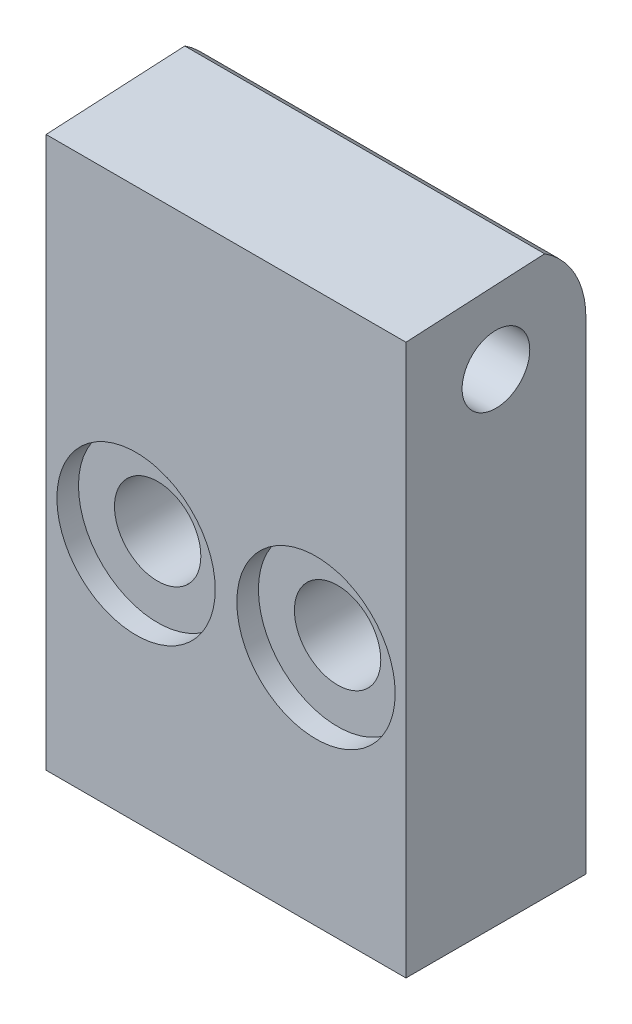
ISO-10303-21;
HEADER;
FILE_DESCRIPTION(('STEP AP214'),'2;1');
FILE_NAME('part.step','',(''),(''),'','','');
FILE_SCHEMA(('AUTOMOTIVE_DESIGN { 1 0 10303 214 1 1 1 1 }'));
ENDSEC;
DATA;
#1=APPLICATION_CONTEXT('core data for automotive mechanical design processes');
#2=APPLICATION_PROTOCOL_DEFINITION('international standard','automotive_design',2000,#1);
#3=PRODUCT_CONTEXT('',#1,'mechanical');
#4=PRODUCT('Part','Part','',(#3));
#5=PRODUCT_RELATED_PRODUCT_CATEGORY('part','',(#4));
#6=PRODUCT_DEFINITION_FORMATION('','',#4);
#7=PRODUCT_DEFINITION_CONTEXT('part definition',#1,'design');
#8=PRODUCT_DEFINITION('design','',#6,#7);
#9=PRODUCT_DEFINITION_SHAPE('','',#8);
#10=(LENGTH_UNIT() NAMED_UNIT(*) SI_UNIT(.MILLI.,.METRE.));
#11=(NAMED_UNIT(*) PLANE_ANGLE_UNIT() SI_UNIT($,.RADIAN.));
#12=(NAMED_UNIT(*) SI_UNIT($,.STERADIAN.) SOLID_ANGLE_UNIT());
#13=UNCERTAINTY_MEASURE_WITH_UNIT(LENGTH_MEASURE(1.E-05),#10,'distance_accuracy_value','');
#14=(GEOMETRIC_REPRESENTATION_CONTEXT(3) GLOBAL_UNCERTAINTY_ASSIGNED_CONTEXT((#13)) GLOBAL_UNIT_ASSIGNED_CONTEXT((#10,
#11,#12)) REPRESENTATION_CONTEXT('',''));
#15=CARTESIAN_POINT('',(0.,0.,0.));
#16=DIRECTION('',(0.,0.,1.));
#17=DIRECTION('',(1.,0.,0.));
#18=AXIS2_PLACEMENT_3D('',#15,#16,#17);
#19=CARTESIAN_POINT('',(9.525,8.509,0.));
#20=DIRECTION('',(0.,0.,1.));
#21=DIRECTION('',(1.,0.,0.));
#22=AXIS2_PLACEMENT_3D('',#19,#20,#21);
#23=CYLINDRICAL_SURFACE('',#22,1.524);
#24=CARTESIAN_POINT('',(9.525,8.509,0.));
#25=DIRECTION('',(0.,0.,1.));
#26=DIRECTION('',(1.,0.,0.));
#27=AXIS2_PLACEMENT_3D('',#24,#25,#26);
#28=CIRCLE('',#27,1.524);
#29=CARTESIAN_POINT('',(11.049,8.509,0.));
#30=VERTEX_POINT('',#29);
#31=EDGE_CURVE('E116',#30,#30,#28,.T.);
#32=ORIENTED_EDGE('',*,*,#31,.F.);
#33=EDGE_LOOP('',(#32));
#34=FACE_BOUND('',#33,.T.);
#35=CARTESIAN_POINT('',(9.525,8.509,5.588));
#36=DIRECTION('',(0.,0.,1.));
#37=DIRECTION('',(1.,0.,0.));
#38=AXIS2_PLACEMENT_3D('',#35,#36,#37);
#39=CIRCLE('',#38,1.524);
#40=CARTESIAN_POINT('',(11.049,8.509,5.588));
#41=VERTEX_POINT('',#40);
#42=EDGE_CURVE('E118',#41,#41,#39,.F.);
#43=ORIENTED_EDGE('',*,*,#42,.F.);
#44=EDGE_LOOP('',(#43));
#45=FACE_BOUND('',#44,.T.);
#46=ADVANCED_FACE('F33',(#34,#45),#23,.F.);
#47=CARTESIAN_POINT('',(3.175,8.509,0.));
#48=DIRECTION('',(0.,0.,1.));
#49=DIRECTION('',(1.,0.,0.));
#50=AXIS2_PLACEMENT_3D('',#47,#48,#49);
#51=CYLINDRICAL_SURFACE('',#50,1.524);
#52=CARTESIAN_POINT('',(3.175,8.509,0.));
#53=DIRECTION('',(0.,0.,1.));
#54=DIRECTION('',(1.,0.,0.));
#55=AXIS2_PLACEMENT_3D('',#52,#53,#54);
#56=CIRCLE('',#55,1.524);
#57=CARTESIAN_POINT('',(4.699,8.509,0.));
#58=VERTEX_POINT('',#57);
#59=EDGE_CURVE('E103',#58,#58,#56,.T.);
#60=ORIENTED_EDGE('',*,*,#59,.F.);
#61=EDGE_LOOP('',(#60));
#62=FACE_BOUND('',#61,.T.);
#63=CARTESIAN_POINT('',(3.175,8.509,5.588));
#64=DIRECTION('',(0.,0.,1.));
#65=DIRECTION('',(1.,0.,0.));
#66=AXIS2_PLACEMENT_3D('',#63,#64,#65);
#67=CIRCLE('',#66,1.524);
#68=CARTESIAN_POINT('',(4.699,8.509,5.588));
#69=VERTEX_POINT('',#68);
#70=EDGE_CURVE('E114',#69,#69,#67,.F.);
#71=ORIENTED_EDGE('',*,*,#70,.F.);
#72=EDGE_LOOP('',(#71));
#73=FACE_BOUND('',#72,.T.);
#74=ADVANCED_FACE('F147',(#62,#73),#51,.F.);
#75=CARTESIAN_POINT('',(0.,0.,6.35));
#76=DIRECTION('',(1.,0.,0.));
#77=DIRECTION('',(0.,0.,-1.));
#78=AXIS2_PLACEMENT_3D('',#75,#76,#77);
#79=PLANE('',#78);
#80=CARTESIAN_POINT('',(0.,17.018,3.175));
#81=DIRECTION('',(1.,0.,0.));
#82=DIRECTION('',(0.,0.,-1.));
#83=AXIS2_PLACEMENT_3D('',#80,#81,#82);
#84=CIRCLE('',#83,1.1938);
#85=CARTESIAN_POINT('',(0.,17.018,1.9812));
#86=VERTEX_POINT('',#85);
#87=EDGE_CURVE('E132',#86,#86,#84,.T.);
#88=ORIENTED_EDGE('',*,*,#87,.T.);
#89=EDGE_LOOP('',(#88));
#90=FACE_BOUND('',#89,.T.);
#91=DIRECTION('',(0.,-1.,0.));
#92=VECTOR('',#91,1.);
#93=CARTESIAN_POINT('',(0.,0.,6.35));
#94=LINE('',#93,#92);
#95=CARTESIAN_POINT('',(0.,19.431,6.35));
#96=VERTEX_POINT('',#95);
#97=CARTESIAN_POINT('',(0.,0.,6.35));
#98=VERTEX_POINT('',#97);
#99=EDGE_CURVE('E89',#96,#98,#94,.T.);
#100=ORIENTED_EDGE('',*,*,#99,.F.);
#101=DIRECTION('',(0.,0.0523359562429444,-0.998629534754574));
#102=VECTOR('',#101,1.);
#103=CARTESIAN_POINT('',(0.,19.431,6.35));
#104=LINE('',#103,#102);
#105=CARTESIAN_POINT('',(0.,19.6874769183394,1.45612886391876));
#106=VERTEX_POINT('',#105);
#107=EDGE_CURVE('E78',#96,#106,#104,.T.);
#108=ORIENTED_EDGE('',*,*,#107,.T.);
#109=CARTESIAN_POINT('',(0.,17.018,3.175));
#110=DIRECTION('',(-1.,0.,0.));
#111=DIRECTION('',(0.,0.,1.));
#112=AXIS2_PLACEMENT_3D('',#109,#110,#111);
#113=CIRCLE('',#112,3.175);
#114=CARTESIAN_POINT('',(0.,17.018,0.));
#115=VERTEX_POINT('',#114);
#116=EDGE_CURVE('E195',#106,#115,#113,.T.);
#117=ORIENTED_EDGE('',*,*,#116,.T.);
#118=DIRECTION('',(0.,-1.,0.));
#119=VECTOR('',#118,1.);
#120=CARTESIAN_POINT('',(0.,0.,0.));
#121=LINE('',#120,#119);
#122=CARTESIAN_POINT('',(0.,0.,0.));
#123=VERTEX_POINT('',#122);
#124=EDGE_CURVE('E108',#115,#123,#121,.T.);
#125=ORIENTED_EDGE('',*,*,#124,.T.);
#126=DIRECTION('',(0.,0.,-1.));
#127=VECTOR('',#126,1.);
#128=CARTESIAN_POINT('',(0.,0.,6.35));
#129=LINE('',#128,#127);
#130=EDGE_CURVE('E41',#98,#123,#129,.T.);
#131=ORIENTED_EDGE('',*,*,#130,.F.);
#132=EDGE_LOOP('',(#100,#108,#117,#125,#131));
#133=FACE_BOUND('',#132,.T.);
#134=ADVANCED_FACE('F35',(#90,#133),#79,.F.);
#135=CARTESIAN_POINT('',(0.,0.,6.35));
#136=DIRECTION('',(0.,1.,0.));
#137=DIRECTION('',(0.,0.,1.));
#138=AXIS2_PLACEMENT_3D('',#135,#136,#137);
#139=PLANE('',#138);
#140=DIRECTION('',(1.,0.,0.));
#141=VECTOR('',#140,1.);
#142=CARTESIAN_POINT('',(0.,0.,0.));
#143=LINE('',#142,#141);
#144=CARTESIAN_POINT('',(12.7,0.,0.));
#145=VERTEX_POINT('',#144);
#146=EDGE_CURVE('E100',#123,#145,#143,.T.);
#147=ORIENTED_EDGE('',*,*,#146,.T.);
#148=DIRECTION('',(0.,0.,-1.));
#149=VECTOR('',#148,1.);
#150=CARTESIAN_POINT('',(12.7,0.,6.35));
#151=LINE('',#150,#149);
#152=CARTESIAN_POINT('',(12.7,0.,6.35));
#153=VERTEX_POINT('',#152);
#154=EDGE_CURVE('E107',#153,#145,#151,.T.);
#155=ORIENTED_EDGE('',*,*,#154,.F.);
#156=DIRECTION('',(1.,0.,0.));
#157=VECTOR('',#156,1.);
#158=CARTESIAN_POINT('',(0.,0.,6.35));
#159=LINE('',#158,#157);
#160=EDGE_CURVE('E96',#98,#153,#159,.T.);
#161=ORIENTED_EDGE('',*,*,#160,.F.);
#162=ORIENTED_EDGE('',*,*,#130,.T.);
#163=EDGE_LOOP('',(#147,#155,#161,#162));
#164=FACE_BOUND('',#163,.T.);
#165=ADVANCED_FACE('F180',(#164),#139,.F.);
#166=CARTESIAN_POINT('',(12.7,0.,6.35));
#167=DIRECTION('',(-1.,0.,0.));
#168=DIRECTION('',(0.,0.,1.));
#169=AXIS2_PLACEMENT_3D('',#166,#167,#168);
#170=PLANE('',#169);
#171=CARTESIAN_POINT('',(12.7,17.018,3.175));
#172=DIRECTION('',(1.,0.,0.));
#173=DIRECTION('',(0.,0.,-1.));
#174=AXIS2_PLACEMENT_3D('',#171,#172,#173);
#175=CIRCLE('',#174,1.1938);
#176=CARTESIAN_POINT('',(12.7,17.018,1.9812));
#177=VERTEX_POINT('',#176);
#178=EDGE_CURVE('E135',#177,#177,#175,.T.);
#179=ORIENTED_EDGE('',*,*,#178,.F.);
#180=EDGE_LOOP('',(#179));
#181=FACE_BOUND('',#180,.T.);
#182=CARTESIAN_POINT('',(12.7,17.018,3.175));
#183=DIRECTION('',(-1.,0.,0.));
#184=DIRECTION('',(0.,0.,1.));
#185=AXIS2_PLACEMENT_3D('',#182,#183,#184);
#186=CIRCLE('',#185,3.175);
#187=CARTESIAN_POINT('',(12.7,19.6874769183394,1.45612886391876));
#188=VERTEX_POINT('',#187);
#189=CARTESIAN_POINT('',(12.7,17.018,0.));
#190=VERTEX_POINT('',#189);
#191=EDGE_CURVE('E54',#188,#190,#186,.T.);
#192=ORIENTED_EDGE('',*,*,#191,.F.);
#193=DIRECTION('',(0.,0.0523359562429444,-0.998629534754574));
#194=VECTOR('',#193,1.);
#195=CARTESIAN_POINT('',(12.7,19.431,6.35));
#196=LINE('',#195,#194);
#197=CARTESIAN_POINT('',(12.7,19.431,6.35));
#198=VERTEX_POINT('',#197);
#199=EDGE_CURVE('E48',#198,#188,#196,.T.);
#200=ORIENTED_EDGE('',*,*,#199,.F.);
#201=DIRECTION('',(0.,1.,0.));
#202=VECTOR('',#201,1.);
#203=CARTESIAN_POINT('',(12.7,0.,6.35));
#204=LINE('',#203,#202);
#205=EDGE_CURVE('E92',#153,#198,#204,.T.);
#206=ORIENTED_EDGE('',*,*,#205,.F.);
#207=ORIENTED_EDGE('',*,*,#154,.T.);
#208=DIRECTION('',(0.,1.,0.));
#209=VECTOR('',#208,1.);
#210=CARTESIAN_POINT('',(12.7,0.,0.));
#211=LINE('',#210,#209);
#212=EDGE_CURVE('E97',#145,#190,#211,.T.);
#213=ORIENTED_EDGE('',*,*,#212,.T.);
#214=EDGE_LOOP('',(#192,#200,#206,#207,#213));
#215=FACE_BOUND('',#214,.T.);
#216=ADVANCED_FACE('F176',(#181,#215),#170,.F.);
#217=CARTESIAN_POINT('',(0.,0.,6.35));
#218=DIRECTION('',(0.,0.,-1.));
#219=DIRECTION('',(-1.,0.,0.));
#220=AXIS2_PLACEMENT_3D('',#217,#218,#219);
#221=PLANE('',#220);
#222=CARTESIAN_POINT('',(9.525,8.509,6.35));
#223=DIRECTION('',(0.,0.,1.));
#224=DIRECTION('',(1.,0.,0.));
#225=AXIS2_PLACEMENT_3D('',#222,#223,#224);
#226=CIRCLE('',#225,2.794);
#227=CARTESIAN_POINT('',(12.319,8.509,6.35));
#228=VERTEX_POINT('',#227);
#229=EDGE_CURVE('E127',#228,#228,#226,.T.);
#230=ORIENTED_EDGE('',*,*,#229,.F.);
#231=EDGE_LOOP('',(#230));
#232=FACE_BOUND('',#231,.T.);
#233=CARTESIAN_POINT('',(3.175,8.509,6.35));
#234=DIRECTION('',(0.,0.,1.));
#235=DIRECTION('',(1.,0.,0.));
#236=AXIS2_PLACEMENT_3D('',#233,#234,#235);
#237=CIRCLE('',#236,2.794);
#238=CARTESIAN_POINT('',(5.969,8.509,6.35));
#239=VERTEX_POINT('',#238);
#240=EDGE_CURVE('E120',#239,#239,#237,.T.);
#241=ORIENTED_EDGE('',*,*,#240,.F.);
#242=EDGE_LOOP('',(#241));
#243=FACE_BOUND('',#242,.T.);
#244=ORIENTED_EDGE('',*,*,#205,.T.);
#245=DIRECTION('',(1.,0.,0.));
#246=VECTOR('',#245,1.);
#247=CARTESIAN_POINT('',(0.,19.431,6.35));
#248=LINE('',#247,#246);
#249=EDGE_CURVE('E81',#96,#198,#248,.T.);
#250=ORIENTED_EDGE('',*,*,#249,.F.);
#251=ORIENTED_EDGE('',*,*,#99,.T.);
#252=ORIENTED_EDGE('',*,*,#160,.T.);
#253=EDGE_LOOP('',(#244,#250,#251,#252));
#254=FACE_BOUND('',#253,.T.);
#255=ADVANCED_FACE('F88',(#232,#243,#254),#221,.F.);
#256=CARTESIAN_POINT('',(0.,0.,0.));
#257=DIRECTION('',(0.,0.,-1.));
#258=DIRECTION('',(-1.,0.,0.));
#259=AXIS2_PLACEMENT_3D('',#256,#257,#258);
#260=PLANE('',#259);
#261=ORIENTED_EDGE('',*,*,#146,.F.);
#262=ORIENTED_EDGE('',*,*,#124,.F.);
#263=DIRECTION('',(1.,0.,0.));
#264=VECTOR('',#263,1.);
#265=CARTESIAN_POINT('',(0.,17.018,0.));
#266=LINE('',#265,#264);
#267=EDGE_CURVE('E194',#115,#190,#266,.T.);
#268=ORIENTED_EDGE('',*,*,#267,.T.);
#269=ORIENTED_EDGE('',*,*,#212,.F.);
#270=EDGE_LOOP('',(#261,#262,#268,#269));
#271=FACE_BOUND('',#270,.T.);
#272=ORIENTED_EDGE('',*,*,#31,.T.);
#273=EDGE_LOOP('',(#272));
#274=FACE_BOUND('',#273,.T.);
#275=ORIENTED_EDGE('',*,*,#59,.T.);
#276=EDGE_LOOP('',(#275));
#277=FACE_BOUND('',#276,.T.);
#278=ADVANCED_FACE('F145',(#271,#274,#277),#260,.T.);
#279=CARTESIAN_POINT('',(3.175,8.509,5.588));
#280=DIRECTION('',(0.,0.,1.));
#281=DIRECTION('',(1.,0.,0.));
#282=AXIS2_PLACEMENT_3D('',#279,#280,#281);
#283=PLANE('',#282);
#284=CARTESIAN_POINT('',(3.175,8.509,5.588));
#285=DIRECTION('',(0.,0.,1.));
#286=DIRECTION('',(1.,0.,0.));
#287=AXIS2_PLACEMENT_3D('',#284,#285,#286);
#288=CIRCLE('',#287,2.794);
#289=CARTESIAN_POINT('',(5.969,8.509,5.588));
#290=VERTEX_POINT('',#289);
#291=EDGE_CURVE('E117',#290,#290,#288,.T.);
#292=ORIENTED_EDGE('',*,*,#291,.T.);
#293=EDGE_LOOP('',(#292));
#294=FACE_BOUND('',#293,.T.);
#295=ORIENTED_EDGE('',*,*,#70,.T.);
#296=EDGE_LOOP('',(#295));
#297=FACE_BOUND('',#296,.T.);
#298=ADVANCED_FACE('F153',(#294,#297),#283,.T.);
#299=CARTESIAN_POINT('',(3.175,8.509,5.588));
#300=DIRECTION('',(0.,0.,1.));
#301=DIRECTION('',(1.,0.,0.));
#302=AXIS2_PLACEMENT_3D('',#299,#300,#301);
#303=CYLINDRICAL_SURFACE('',#302,2.794);
#304=CARTESIAN_POINT('',(5.969,8.509,5.588));
#305=CARTESIAN_POINT('',(5.969,8.509,5.5959375));
#306=CARTESIAN_POINT('',(5.969,8.509,5.603875));
#307=CARTESIAN_POINT('',(5.969,8.509,5.61975));
#308=CARTESIAN_POINT('',(5.969,8.509,5.6276875));
#309=CARTESIAN_POINT('',(5.969,8.509,5.6435625));
#310=CARTESIAN_POINT('',(5.969,8.509,5.6515));
#311=CARTESIAN_POINT('',(5.969,8.509,5.667375));
#312=CARTESIAN_POINT('',(5.969,8.509,5.6753125));
#313=CARTESIAN_POINT('',(5.969,8.509,5.6911875));
#314=CARTESIAN_POINT('',(5.969,8.509,5.699125));
#315=CARTESIAN_POINT('',(5.969,8.509,5.715));
#316=CARTESIAN_POINT('',(5.969,8.509,5.7229375));
#317=CARTESIAN_POINT('',(5.969,8.509,5.7388125));
#318=CARTESIAN_POINT('',(5.969,8.509,5.74675));
#319=CARTESIAN_POINT('',(5.969,8.509,5.762625));
#320=CARTESIAN_POINT('',(5.969,8.509,5.7705625));
#321=CARTESIAN_POINT('',(5.969,8.509,5.7864375));
#322=CARTESIAN_POINT('',(5.969,8.509,5.794375));
#323=CARTESIAN_POINT('',(5.969,8.509,5.81025));
#324=CARTESIAN_POINT('',(5.969,8.509,5.8181875));
#325=CARTESIAN_POINT('',(5.969,8.509,5.8340625));
#326=CARTESIAN_POINT('',(5.969,8.509,5.842));
#327=CARTESIAN_POINT('',(5.969,8.509,5.857875));
#328=CARTESIAN_POINT('',(5.969,8.509,5.8658125));
#329=CARTESIAN_POINT('',(5.969,8.509,5.8816875));
#330=CARTESIAN_POINT('',(5.969,8.509,5.889625));
#331=CARTESIAN_POINT('',(5.969,8.509,5.9055));
#332=CARTESIAN_POINT('',(5.969,8.509,5.9134375));
#333=CARTESIAN_POINT('',(5.969,8.509,5.9293125));
#334=CARTESIAN_POINT('',(5.969,8.509,5.93725));
#335=CARTESIAN_POINT('',(5.969,8.509,5.953125));
#336=CARTESIAN_POINT('',(5.969,8.509,5.9610625));
#337=CARTESIAN_POINT('',(5.969,8.509,5.9769375));
#338=CARTESIAN_POINT('',(5.969,8.509,5.984875));
#339=CARTESIAN_POINT('',(5.969,8.509,6.00075));
#340=CARTESIAN_POINT('',(5.969,8.509,6.0086875));
#341=CARTESIAN_POINT('',(5.969,8.509,6.0245625));
#342=CARTESIAN_POINT('',(5.969,8.509,6.0325));
#343=CARTESIAN_POINT('',(5.969,8.509,6.048375));
#344=CARTESIAN_POINT('',(5.969,8.509,6.0563125));
#345=CARTESIAN_POINT('',(5.969,8.509,6.0721875));
#346=CARTESIAN_POINT('',(5.969,8.509,6.080125));
#347=CARTESIAN_POINT('',(5.969,8.509,6.096));
#348=CARTESIAN_POINT('',(5.969,8.509,6.1039375));
#349=CARTESIAN_POINT('',(5.969,8.509,6.1198125));
#350=CARTESIAN_POINT('',(5.969,8.509,6.12775));
#351=CARTESIAN_POINT('',(5.969,8.509,6.143625));
#352=CARTESIAN_POINT('',(5.969,8.509,6.1515625));
#353=CARTESIAN_POINT('',(5.969,8.509,6.1674375));
#354=CARTESIAN_POINT('',(5.969,8.509,6.175375));
#355=CARTESIAN_POINT('',(5.969,8.509,6.19125));
#356=CARTESIAN_POINT('',(5.969,8.509,6.1991875));
#357=CARTESIAN_POINT('',(5.969,8.509,6.2150625));
#358=CARTESIAN_POINT('',(5.969,8.509,6.223));
#359=CARTESIAN_POINT('',(5.969,8.509,6.238875));
#360=CARTESIAN_POINT('',(5.969,8.509,6.2468125));
#361=CARTESIAN_POINT('',(5.969,8.509,6.2626875));
#362=CARTESIAN_POINT('',(5.969,8.509,6.270625));
#363=CARTESIAN_POINT('',(5.969,8.509,6.2865));
#364=CARTESIAN_POINT('',(5.969,8.509,6.2944375));
#365=CARTESIAN_POINT('',(5.969,8.509,6.3103125));
#366=CARTESIAN_POINT('',(5.969,8.509,6.31825));
#367=CARTESIAN_POINT('',(5.969,8.509,6.334125));
#368=CARTESIAN_POINT('',(5.969,8.509,6.3420625));
#369=CARTESIAN_POINT('',(5.969,8.509,6.35));
#370=B_SPLINE_CURVE_WITH_KNOTS('',3,(#304,#305,#306,#307,#308,#309,#310,#311,#312,#313,#314,
#315,#316,#317,#318,#319,#320,#321,#322,#323,#324,#325,#326,#327,#328,#329,#330,#331,#332,#333,
#334,#335,#336,#337,#338,#339,#340,#341,#342,#343,#344,#345,#346,#347,#348,#349,#350,#351,#352,
#353,#354,#355,#356,#357,#358,#359,#360,#361,#362,#363,#364,#365,#366,#367,#368,#369),
.UNSPECIFIED.,.F.,.F.,(4,2,2,2,2,2,2,2,2,2,2,2,2,2,2,2,2,2,2,2,2,2,2,2,2,2,2,2,2,2,2,2,4),(0.,
0.0238124999999995,0.0476249999999999,0.0714374999999995,0.0952499999999998,0.119062499999999,
0.142875,0.166687499999999,0.1905,0.214312499999999,0.238125,0.261937499999999,0.28575,
0.309562499999999,0.333374999999999,0.357187499999999,0.380999999999999,0.404812499999999,
0.428624999999999,0.4524375,0.476249999999999,0.5000625,0.523874999999999,0.5476875,
0.571499999999999,0.595312499999999,0.619124999999999,0.642937499999999,0.666749999999999,
0.690562499999999,0.714374999999999,0.738187499999999,0.761999999999999),.UNSPECIFIED.);
#371=EDGE_CURVE('BSEAM155',#290,#239,#370,.T.);
#372=ORIENTED_EDGE('',*,*,#291,.F.);
#373=ORIENTED_EDGE('',*,*,#240,.T.);
#374=ORIENTED_EDGE('',*,*,#371,.T.);
#375=ORIENTED_EDGE('',*,*,#371,.F.);
#376=EDGE_LOOP('',(#372,#374,#373,#375));
#377=FACE_BOUND('',#376,.T.);
#378=ADVANCED_FACE('F155',(#377),#303,.F.);
#379=CARTESIAN_POINT('',(9.525,8.509,5.588));
#380=DIRECTION('',(0.,0.,1.));
#381=DIRECTION('',(1.,0.,0.));
#382=AXIS2_PLACEMENT_3D('',#379,#380,#381);
#383=PLANE('',#382);
#384=CARTESIAN_POINT('',(9.525,8.509,5.588));
#385=DIRECTION('',(0.,0.,1.));
#386=DIRECTION('',(1.,0.,0.));
#387=AXIS2_PLACEMENT_3D('',#384,#385,#386);
#388=CIRCLE('',#387,2.794);
#389=CARTESIAN_POINT('',(12.319,8.509,5.588));
#390=VERTEX_POINT('',#389);
#391=EDGE_CURVE('E121',#390,#390,#388,.T.);
#392=ORIENTED_EDGE('',*,*,#391,.T.);
#393=EDGE_LOOP('',(#392));
#394=FACE_BOUND('',#393,.T.);
#395=ORIENTED_EDGE('',*,*,#42,.T.);
#396=EDGE_LOOP('',(#395));
#397=FACE_BOUND('',#396,.T.);
#398=ADVANCED_FACE('F162',(#394,#397),#383,.T.);
#399=CARTESIAN_POINT('',(9.525,8.509,5.588));
#400=DIRECTION('',(0.,0.,1.));
#401=DIRECTION('',(1.,0.,0.));
#402=AXIS2_PLACEMENT_3D('',#399,#400,#401);
#403=CYLINDRICAL_SURFACE('',#402,2.794);
#404=CARTESIAN_POINT('',(12.319,8.509,5.588));
#405=CARTESIAN_POINT('',(12.319,8.509,5.5959375));
#406=CARTESIAN_POINT('',(12.319,8.509,5.603875));
#407=CARTESIAN_POINT('',(12.319,8.509,5.61975));
#408=CARTESIAN_POINT('',(12.319,8.509,5.6276875));
#409=CARTESIAN_POINT('',(12.319,8.509,5.6435625));
#410=CARTESIAN_POINT('',(12.319,8.509,5.6515));
#411=CARTESIAN_POINT('',(12.319,8.509,5.667375));
#412=CARTESIAN_POINT('',(12.319,8.509,5.6753125));
#413=CARTESIAN_POINT('',(12.319,8.509,5.6911875));
#414=CARTESIAN_POINT('',(12.319,8.509,5.699125));
#415=CARTESIAN_POINT('',(12.319,8.509,5.715));
#416=CARTESIAN_POINT('',(12.319,8.509,5.7229375));
#417=CARTESIAN_POINT('',(12.319,8.509,5.7388125));
#418=CARTESIAN_POINT('',(12.319,8.509,5.74675));
#419=CARTESIAN_POINT('',(12.319,8.509,5.762625));
#420=CARTESIAN_POINT('',(12.319,8.509,5.7705625));
#421=CARTESIAN_POINT('',(12.319,8.509,5.7864375));
#422=CARTESIAN_POINT('',(12.319,8.509,5.794375));
#423=CARTESIAN_POINT('',(12.319,8.509,5.81025));
#424=CARTESIAN_POINT('',(12.319,8.509,5.8181875));
#425=CARTESIAN_POINT('',(12.319,8.509,5.8340625));
#426=CARTESIAN_POINT('',(12.319,8.509,5.842));
#427=CARTESIAN_POINT('',(12.319,8.509,5.857875));
#428=CARTESIAN_POINT('',(12.319,8.509,5.8658125));
#429=CARTESIAN_POINT('',(12.319,8.509,5.8816875));
#430=CARTESIAN_POINT('',(12.319,8.509,5.889625));
#431=CARTESIAN_POINT('',(12.319,8.509,5.9055));
#432=CARTESIAN_POINT('',(12.319,8.509,5.9134375));
#433=CARTESIAN_POINT('',(12.319,8.509,5.9293125));
#434=CARTESIAN_POINT('',(12.319,8.509,5.93725));
#435=CARTESIAN_POINT('',(12.319,8.509,5.953125));
#436=CARTESIAN_POINT('',(12.319,8.509,5.9610625));
#437=CARTESIAN_POINT('',(12.319,8.509,5.9769375));
#438=CARTESIAN_POINT('',(12.319,8.509,5.984875));
#439=CARTESIAN_POINT('',(12.319,8.509,6.00075));
#440=CARTESIAN_POINT('',(12.319,8.509,6.0086875));
#441=CARTESIAN_POINT('',(12.319,8.509,6.0245625));
#442=CARTESIAN_POINT('',(12.319,8.509,6.0325));
#443=CARTESIAN_POINT('',(12.319,8.509,6.048375));
#444=CARTESIAN_POINT('',(12.319,8.509,6.0563125));
#445=CARTESIAN_POINT('',(12.319,8.509,6.0721875));
#446=CARTESIAN_POINT('',(12.319,8.509,6.080125));
#447=CARTESIAN_POINT('',(12.319,8.509,6.096));
#448=CARTESIAN_POINT('',(12.319,8.509,6.1039375));
#449=CARTESIAN_POINT('',(12.319,8.509,6.1198125));
#450=CARTESIAN_POINT('',(12.319,8.509,6.12775));
#451=CARTESIAN_POINT('',(12.319,8.509,6.143625));
#452=CARTESIAN_POINT('',(12.319,8.509,6.1515625));
#453=CARTESIAN_POINT('',(12.319,8.509,6.1674375));
#454=CARTESIAN_POINT('',(12.319,8.509,6.175375));
#455=CARTESIAN_POINT('',(12.319,8.509,6.19125));
#456=CARTESIAN_POINT('',(12.319,8.509,6.1991875));
#457=CARTESIAN_POINT('',(12.319,8.509,6.2150625));
#458=CARTESIAN_POINT('',(12.319,8.509,6.223));
#459=CARTESIAN_POINT('',(12.319,8.509,6.238875));
#460=CARTESIAN_POINT('',(12.319,8.509,6.2468125));
#461=CARTESIAN_POINT('',(12.319,8.509,6.2626875));
#462=CARTESIAN_POINT('',(12.319,8.509,6.270625));
#463=CARTESIAN_POINT('',(12.319,8.509,6.2865));
#464=CARTESIAN_POINT('',(12.319,8.509,6.2944375));
#465=CARTESIAN_POINT('',(12.319,8.509,6.3103125));
#466=CARTESIAN_POINT('',(12.319,8.509,6.31825));
#467=CARTESIAN_POINT('',(12.319,8.509,6.334125));
#468=CARTESIAN_POINT('',(12.319,8.509,6.3420625));
#469=CARTESIAN_POINT('',(12.319,8.509,6.35));
#470=B_SPLINE_CURVE_WITH_KNOTS('',3,(#404,#405,#406,#407,#408,#409,#410,#411,#412,#413,#414,
#415,#416,#417,#418,#419,#420,#421,#422,#423,#424,#425,#426,#427,#428,#429,#430,#431,#432,#433,
#434,#435,#436,#437,#438,#439,#440,#441,#442,#443,#444,#445,#446,#447,#448,#449,#450,#451,#452,
#453,#454,#455,#456,#457,#458,#459,#460,#461,#462,#463,#464,#465,#466,#467,#468,#469),
.UNSPECIFIED.,.F.,.F.,(4,2,2,2,2,2,2,2,2,2,2,2,2,2,2,2,2,2,2,2,2,2,2,2,2,2,2,2,2,2,2,2,4),(0.,
0.0238124999999995,0.0476249999999999,0.0714374999999995,0.0952499999999998,0.119062499999999,
0.142875,0.166687499999999,0.1905,0.214312499999999,0.238125,0.261937499999999,0.28575,
0.309562499999999,0.333374999999999,0.357187499999999,0.380999999999999,0.404812499999999,
0.428624999999999,0.4524375,0.476249999999999,0.5000625,0.523874999999999,0.5476875,
0.571499999999999,0.595312499999999,0.619124999999999,0.642937499999999,0.666749999999999,
0.690562499999999,0.714374999999999,0.738187499999999,0.761999999999999),.UNSPECIFIED.);
#471=EDGE_CURVE('BSEAM207',#390,#228,#470,.T.);
#472=ORIENTED_EDGE('',*,*,#391,.F.);
#473=ORIENTED_EDGE('',*,*,#229,.T.);
#474=ORIENTED_EDGE('',*,*,#471,.T.);
#475=ORIENTED_EDGE('',*,*,#471,.F.);
#476=EDGE_LOOP('',(#472,#474,#473,#475));
#477=FACE_BOUND('',#476,.T.);
#478=ADVANCED_FACE('F207',(#477),#403,.F.);
#479=CARTESIAN_POINT('',(0.,17.018,3.175));
#480=DIRECTION('',(1.,0.,0.));
#481=DIRECTION('',(0.,0.,-1.));
#482=AXIS2_PLACEMENT_3D('',#479,#480,#481);
#483=CYLINDRICAL_SURFACE('',#482,1.1938);
#484=ORIENTED_EDGE('',*,*,#87,.F.);
#485=EDGE_LOOP('',(#484));
#486=FACE_BOUND('',#485,.T.);
#487=ORIENTED_EDGE('',*,*,#178,.T.);
#488=EDGE_LOOP('',(#487));
#489=FACE_BOUND('',#488,.T.);
#490=ADVANCED_FACE('F203',(#486,#489),#483,.F.);
#491=CARTESIAN_POINT('',(0.,17.018,3.175));
#492=DIRECTION('',(1.,0.,0.));
#493=DIRECTION('',(0.,0.,-1.));
#494=AXIS2_PLACEMENT_3D('',#491,#492,#493);
#495=CYLINDRICAL_SURFACE('',#494,3.175);
#496=ORIENTED_EDGE('',*,*,#116,.F.);
#497=DIRECTION('',(1.,0.,0.));
#498=VECTOR('',#497,1.);
#499=CARTESIAN_POINT('',(0.,19.6874769183394,1.45612886391876));
#500=LINE('',#499,#498);
#501=EDGE_CURVE('E11',#106,#188,#500,.T.);
#502=ORIENTED_EDGE('',*,*,#501,.T.);
#503=ORIENTED_EDGE('',*,*,#191,.T.);
#504=ORIENTED_EDGE('',*,*,#267,.F.);
#505=EDGE_LOOP('',(#496,#502,#503,#504));
#506=FACE_BOUND('',#505,.T.);
#507=ADVANCED_FACE('F206',(#506),#495,.T.);
#508=CARTESIAN_POINT('',(0.,19.431,6.35));
#509=DIRECTION('',(0.,-0.998629534754574,-0.0523359562429444));
#510=DIRECTION('',(0.,0.0523359562429444,-0.998629534754574));
#511=AXIS2_PLACEMENT_3D('',#508,#509,#510);
#512=PLANE('',#511);
#513=ORIENTED_EDGE('',*,*,#107,.F.);
#514=ORIENTED_EDGE('',*,*,#249,.T.);
#515=ORIENTED_EDGE('',*,*,#199,.T.);
#516=ORIENTED_EDGE('',*,*,#501,.F.);
#517=EDGE_LOOP('',(#513,#514,#515,#516));
#518=FACE_BOUND('',#517,.T.);
#519=ADVANCED_FACE('F80',(#518),#512,.F.);
#520=CLOSED_SHELL('',(#46,#74,#134,#165,#216,#255,#278,#298,#378,#398,#478,#490,#507,#519));
#521=MANIFOLD_SOLID_BREP('B2',#520);
#522=ADVANCED_BREP_SHAPE_REPRESENTATION('',(#18,#521),#14);
#523=SHAPE_DEFINITION_REPRESENTATION(#9,#522);
ENDSEC;
END-ISO-10303-21;
